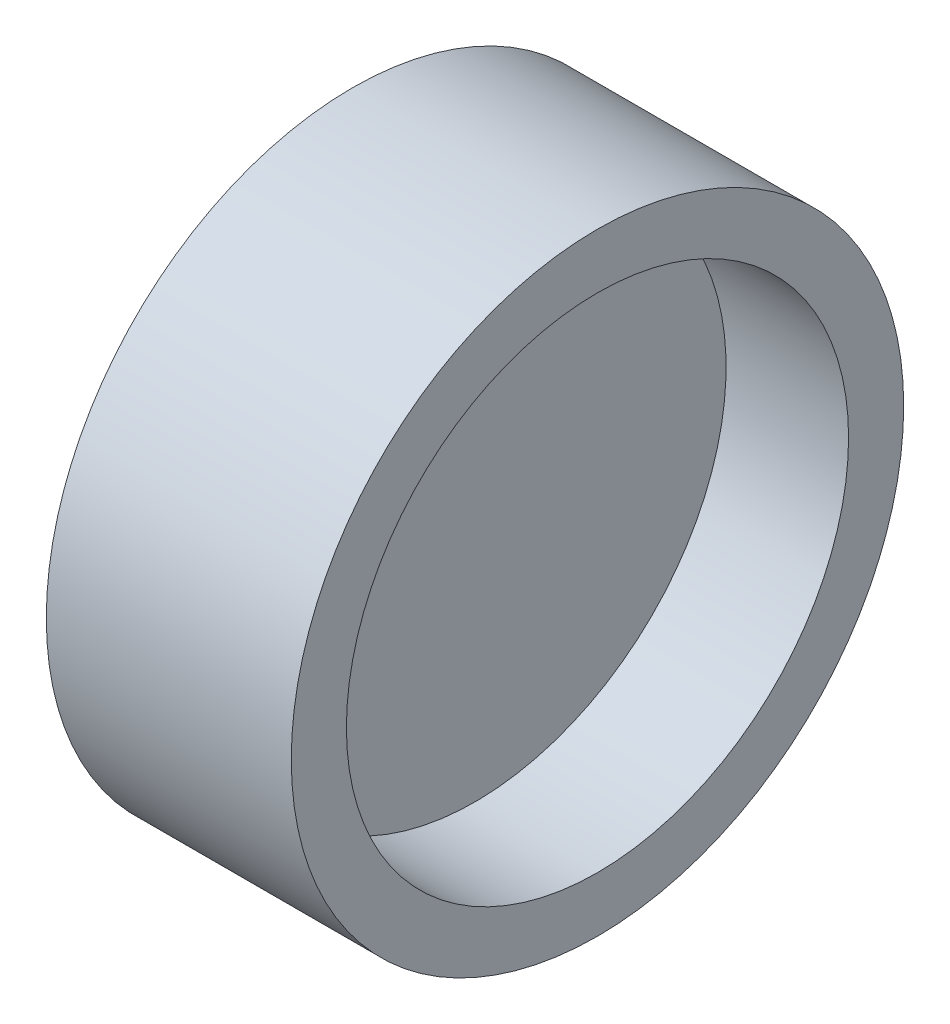
ISO-10303-21;
HEADER;
FILE_DESCRIPTION(('STEP AP214'),'2;1');
FILE_NAME('part.step','',(''),(''),'','','');
FILE_SCHEMA(('AUTOMOTIVE_DESIGN { 1 0 10303 214 1 1 1 1 }'));
ENDSEC;
DATA;
#1=APPLICATION_CONTEXT('core data for automotive mechanical design processes');
#2=APPLICATION_PROTOCOL_DEFINITION('international standard','automotive_design',2000,#1);
#3=PRODUCT_CONTEXT('',#1,'mechanical');
#4=PRODUCT('Part','Part','',(#3));
#5=PRODUCT_RELATED_PRODUCT_CATEGORY('part','',(#4));
#6=PRODUCT_DEFINITION_FORMATION('','',#4);
#7=PRODUCT_DEFINITION_CONTEXT('part definition',#1,'design');
#8=PRODUCT_DEFINITION('design','',#6,#7);
#9=PRODUCT_DEFINITION_SHAPE('','',#8);
#10=(LENGTH_UNIT() NAMED_UNIT(*) SI_UNIT(.MILLI.,.METRE.));
#11=(NAMED_UNIT(*) PLANE_ANGLE_UNIT() SI_UNIT($,.RADIAN.));
#12=(NAMED_UNIT(*) SI_UNIT($,.STERADIAN.) SOLID_ANGLE_UNIT());
#13=UNCERTAINTY_MEASURE_WITH_UNIT(LENGTH_MEASURE(1.E-05),#10,'distance_accuracy_value','');
#14=(GEOMETRIC_REPRESENTATION_CONTEXT(3) GLOBAL_UNCERTAINTY_ASSIGNED_CONTEXT((#13)) GLOBAL_UNIT_ASSIGNED_CONTEXT((#10,
#11,#12)) REPRESENTATION_CONTEXT('',''));
#15=CARTESIAN_POINT('',(0.,0.,0.));
#16=DIRECTION('',(0.,0.,1.));
#17=DIRECTION('',(1.,0.,0.));
#18=AXIS2_PLACEMENT_3D('',#15,#16,#17);
#19=CARTESIAN_POINT('',(2.,0.,0.));
#20=DIRECTION('',(-1.,0.,0.));
#21=DIRECTION('',(0.,0.,1.));
#22=AXIS2_PLACEMENT_3D('',#19,#20,#21);
#23=CYLINDRICAL_SURFACE('',#22,2.1);
#24=CARTESIAN_POINT('',(0.,0.,0.));
#25=DIRECTION('',(-1.,0.,0.));
#26=DIRECTION('',(0.,0.,1.));
#27=AXIS2_PLACEMENT_3D('',#24,#25,#26);
#28=CIRCLE('',#27,2.1);
#29=CARTESIAN_POINT('',(0.,0.,2.1));
#30=VERTEX_POINT('',#29);
#31=EDGE_CURVE('E68',#30,#30,#28,.T.);
#32=ORIENTED_EDGE('',*,*,#31,.T.);
#33=EDGE_LOOP('',(#32));
#34=FACE_BOUND('',#33,.T.);
#35=CARTESIAN_POINT('',(1.5,0.,0.));
#36=DIRECTION('',(1.,0.,0.));
#37=DIRECTION('',(0.,0.,-1.));
#38=AXIS2_PLACEMENT_3D('',#35,#36,#37);
#39=CIRCLE('',#38,2.1);
#40=CARTESIAN_POINT('',(1.5,0.,-2.1));
#41=VERTEX_POINT('',#40);
#42=EDGE_CURVE('E10',#41,#41,#39,.F.);
#43=ORIENTED_EDGE('',*,*,#42,.F.);
#44=EDGE_LOOP('',(#43));
#45=FACE_BOUND('',#44,.T.);
#46=ADVANCED_FACE('F40',(#34,#45),#23,.F.);
#47=CARTESIAN_POINT('',(4.,0.,0.));
#48=DIRECTION('',(-1.,0.,0.));
#49=DIRECTION('',(0.,0.,1.));
#50=AXIS2_PLACEMENT_3D('',#47,#48,#49);
#51=CYLINDRICAL_SURFACE('',#50,4.1);
#52=CARTESIAN_POINT('',(4.,0.,0.));
#53=DIRECTION('',(1.,0.,0.));
#54=DIRECTION('',(0.,0.,-1.));
#55=AXIS2_PLACEMENT_3D('',#52,#53,#54);
#56=CIRCLE('',#55,4.1);
#57=CARTESIAN_POINT('',(4.,0.,-4.1));
#58=VERTEX_POINT('',#57);
#59=EDGE_CURVE('E59',#58,#58,#56,.T.);
#60=ORIENTED_EDGE('',*,*,#59,.T.);
#61=EDGE_LOOP('',(#60));
#62=FACE_BOUND('',#61,.T.);
#63=CARTESIAN_POINT('',(2.,0.,0.));
#64=DIRECTION('',(-1.,0.,0.));
#65=DIRECTION('',(0.,0.,1.));
#66=AXIS2_PLACEMENT_3D('',#63,#64,#65);
#67=CIRCLE('',#66,4.1);
#68=CARTESIAN_POINT('',(2.,0.,4.1));
#69=VERTEX_POINT('',#68);
#70=EDGE_CURVE('E64',#69,#69,#67,.T.);
#71=ORIENTED_EDGE('',*,*,#70,.T.);
#72=EDGE_LOOP('',(#71));
#73=FACE_BOUND('',#72,.T.);
#74=ADVANCED_FACE('F85',(#62,#73),#51,.F.);
#75=CARTESIAN_POINT('',(4.,0.,0.));
#76=DIRECTION('',(1.,0.,0.));
#77=DIRECTION('',(0.,0.,-1.));
#78=AXIS2_PLACEMENT_3D('',#75,#76,#77);
#79=PLANE('',#78);
#80=CARTESIAN_POINT('',(4.,0.,0.));
#81=DIRECTION('',(1.,0.,0.));
#82=DIRECTION('',(0.,0.,-1.));
#83=AXIS2_PLACEMENT_3D('',#80,#81,#82);
#84=CIRCLE('',#83,5.);
#85=CARTESIAN_POINT('',(4.,0.,-5.));
#86=VERTEX_POINT('',#85);
#87=EDGE_CURVE('E48',#86,#86,#84,.T.);
#88=ORIENTED_EDGE('',*,*,#87,.T.);
#89=EDGE_LOOP('',(#88));
#90=FACE_BOUND('',#89,.T.);
#91=ORIENTED_EDGE('',*,*,#59,.F.);
#92=EDGE_LOOP('',(#91));
#93=FACE_BOUND('',#92,.T.);
#94=ADVANCED_FACE('F77',(#90,#93),#79,.T.);
#95=CARTESIAN_POINT('',(0.,0.,0.));
#96=DIRECTION('',(1.,0.,0.));
#97=DIRECTION('',(0.,0.,-1.));
#98=AXIS2_PLACEMENT_3D('',#95,#96,#97);
#99=PLANE('',#98);
#100=CARTESIAN_POINT('',(0.,0.,0.));
#101=DIRECTION('',(1.,0.,0.));
#102=DIRECTION('',(0.,0.,-1.));
#103=AXIS2_PLACEMENT_3D('',#100,#101,#102);
#104=CIRCLE('',#103,5.);
#105=CARTESIAN_POINT('',(0.,0.,-5.));
#106=VERTEX_POINT('',#105);
#107=EDGE_CURVE('E53',#106,#106,#104,.T.);
#108=ORIENTED_EDGE('',*,*,#107,.F.);
#109=EDGE_LOOP('',(#108));
#110=FACE_BOUND('',#109,.T.);
#111=ORIENTED_EDGE('',*,*,#31,.F.);
#112=EDGE_LOOP('',(#111));
#113=FACE_BOUND('',#112,.T.);
#114=ADVANCED_FACE('F75',(#110,#113),#99,.F.);
#115=CARTESIAN_POINT('',(4.,0.,0.));
#116=DIRECTION('',(-1.,0.,0.));
#117=DIRECTION('',(0.,0.,1.));
#118=AXIS2_PLACEMENT_3D('',#115,#116,#117);
#119=CYLINDRICAL_SURFACE('',#118,5.);
#120=ORIENTED_EDGE('',*,*,#87,.F.);
#121=EDGE_LOOP('',(#120));
#122=FACE_BOUND('',#121,.T.);
#123=ORIENTED_EDGE('',*,*,#107,.T.);
#124=EDGE_LOOP('',(#123));
#125=FACE_BOUND('',#124,.T.);
#126=ADVANCED_FACE('F42',(#122,#125),#119,.T.);
#127=CARTESIAN_POINT('',(2.,0.,0.));
#128=DIRECTION('',(-1.,0.,0.));
#129=DIRECTION('',(0.,0.,1.));
#130=AXIS2_PLACEMENT_3D('',#127,#128,#129);
#131=PLANE('',#130);
#132=ORIENTED_EDGE('',*,*,#70,.F.);
#133=EDGE_LOOP('',(#132));
#134=FACE_BOUND('',#133,.T.);
#135=ADVANCED_FACE('F83',(#134),#131,.F.);
#136=CARTESIAN_POINT('',(1.5,0.,0.));
#137=DIRECTION('',(1.,0.,0.));
#138=DIRECTION('',(0.,0.,-1.));
#139=AXIS2_PLACEMENT_3D('',#136,#137,#138);
#140=PLANE('',#139);
#141=ORIENTED_EDGE('',*,*,#42,.T.);
#142=EDGE_LOOP('',(#141));
#143=FACE_BOUND('',#142,.T.);
#144=ADVANCED_FACE('F97',(#143),#140,.F.);
#145=CLOSED_SHELL('',(#46,#74,#94,#114,#126,#135,#144));
#146=MANIFOLD_SOLID_BREP('B2',#145);
#147=ADVANCED_BREP_SHAPE_REPRESENTATION('',(#18,#146),#14);
#148=SHAPE_DEFINITION_REPRESENTATION(#9,#147);
ENDSEC;
END-ISO-10303-21;
